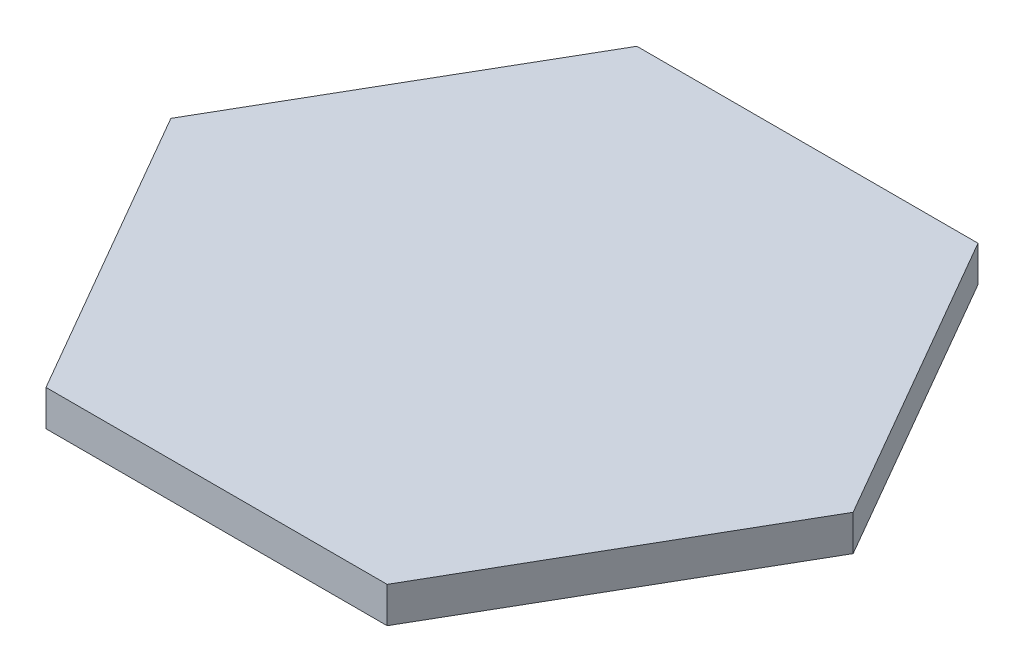
ISO-10303-21;
HEADER;
FILE_DESCRIPTION(('STEP AP214'),'2;1');
FILE_NAME('part.step','',(''),(''),'','','');
FILE_SCHEMA(('AUTOMOTIVE_DESIGN { 1 0 10303 214 1 1 1 1 }'));
ENDSEC;
DATA;
#1=APPLICATION_CONTEXT('core data for automotive mechanical design processes');
#2=APPLICATION_PROTOCOL_DEFINITION('international standard','automotive_design',2000,#1);
#3=PRODUCT_CONTEXT('',#1,'mechanical');
#4=PRODUCT('Part','Part','',(#3));
#5=PRODUCT_RELATED_PRODUCT_CATEGORY('part','',(#4));
#6=PRODUCT_DEFINITION_FORMATION('','',#4);
#7=PRODUCT_DEFINITION_CONTEXT('part definition',#1,'design');
#8=PRODUCT_DEFINITION('design','',#6,#7);
#9=PRODUCT_DEFINITION_SHAPE('','',#8);
#10=(LENGTH_UNIT() NAMED_UNIT(*) SI_UNIT(.MILLI.,.METRE.));
#11=(NAMED_UNIT(*) PLANE_ANGLE_UNIT() SI_UNIT($,.RADIAN.));
#12=(NAMED_UNIT(*) SI_UNIT($,.STERADIAN.) SOLID_ANGLE_UNIT());
#13=UNCERTAINTY_MEASURE_WITH_UNIT(LENGTH_MEASURE(1.E-05),#10,'distance_accuracy_value','');
#14=(GEOMETRIC_REPRESENTATION_CONTEXT(3) GLOBAL_UNCERTAINTY_ASSIGNED_CONTEXT((#13)) GLOBAL_UNIT_ASSIGNED_CONTEXT((#10,
#11,#12)) REPRESENTATION_CONTEXT('',''));
#15=CARTESIAN_POINT('',(0.,0.,0.));
#16=DIRECTION('',(0.,0.,1.));
#17=DIRECTION('',(1.,0.,0.));
#18=AXIS2_PLACEMENT_3D('',#15,#16,#17);
#19=CARTESIAN_POINT('',(35.7,7.5,61.8342138302089));
#20=DIRECTION('',(-0.866025403784439,0.,-0.5));
#21=DIRECTION('',(-0.5,0.,0.866025403784439));
#22=AXIS2_PLACEMENT_3D('',#19,#20,#21);
#23=PLANE('',#22);
#24=DIRECTION('',(0.5,0.,-0.866025403784439));
#25=VECTOR('',#24,1.);
#26=CARTESIAN_POINT('',(35.7,0.,61.8342138302089));
#27=LINE('',#26,#25);
#28=CARTESIAN_POINT('',(35.7,0.,61.8342138302089));
#29=VERTEX_POINT('',#28);
#30=CARTESIAN_POINT('',(71.4,0.,0.));
#31=VERTEX_POINT('',#30);
#32=EDGE_CURVE('E125',#29,#31,#27,.T.);
#33=ORIENTED_EDGE('',*,*,#32,.T.);
#34=DIRECTION('',(0.,-1.,0.));
#35=VECTOR('',#34,1.);
#36=CARTESIAN_POINT('',(71.4,7.5,0.));
#37=LINE('',#36,#35);
#38=CARTESIAN_POINT('',(71.4,7.5,0.));
#39=VERTEX_POINT('',#38);
#40=EDGE_CURVE('E11',#39,#31,#37,.T.);
#41=ORIENTED_EDGE('',*,*,#40,.F.);
#42=DIRECTION('',(0.5,0.,-0.866025403784439));
#43=VECTOR('',#42,1.);
#44=CARTESIAN_POINT('',(35.7,7.5,61.8342138302089));
#45=LINE('',#44,#43);
#46=CARTESIAN_POINT('',(35.7,7.5,61.8342138302089));
#47=VERTEX_POINT('',#46);
#48=EDGE_CURVE('E135',#47,#39,#45,.T.);
#49=ORIENTED_EDGE('',*,*,#48,.F.);
#50=DIRECTION('',(0.,-1.,0.));
#51=VECTOR('',#50,1.);
#52=CARTESIAN_POINT('',(35.7,7.5,61.8342138302089));
#53=LINE('',#52,#51);
#54=EDGE_CURVE('E121',#47,#29,#53,.T.);
#55=ORIENTED_EDGE('',*,*,#54,.T.);
#56=EDGE_LOOP('',(#33,#41,#49,#55));
#57=FACE_BOUND('',#56,.T.);
#58=ADVANCED_FACE('F41',(#57),#23,.F.);
#59=CARTESIAN_POINT('',(71.4,7.5,0.));
#60=DIRECTION('',(-0.866025403784439,0.,0.5));
#61=DIRECTION('',(0.5,0.,0.866025403784439));
#62=AXIS2_PLACEMENT_3D('',#59,#60,#61);
#63=PLANE('',#62);
#64=DIRECTION('',(-0.5,0.,-0.866025403784439));
#65=VECTOR('',#64,1.);
#66=CARTESIAN_POINT('',(71.4,0.,0.));
#67=LINE('',#66,#65);
#68=CARTESIAN_POINT('',(35.7,0.,-61.8342138302089));
#69=VERTEX_POINT('',#68);
#70=EDGE_CURVE('E128',#31,#69,#67,.T.);
#71=ORIENTED_EDGE('',*,*,#70,.T.);
#72=DIRECTION('',(0.,-1.,0.));
#73=VECTOR('',#72,1.);
#74=CARTESIAN_POINT('',(35.7,7.5,-61.8342138302089));
#75=LINE('',#74,#73);
#76=CARTESIAN_POINT('',(35.7,7.5,-61.8342138302089));
#77=VERTEX_POINT('',#76);
#78=EDGE_CURVE('E49',#77,#69,#75,.T.);
#79=ORIENTED_EDGE('',*,*,#78,.F.);
#80=DIRECTION('',(-0.5,0.,-0.866025403784439));
#81=VECTOR('',#80,1.);
#82=CARTESIAN_POINT('',(71.4,7.5,0.));
#83=LINE('',#82,#81);
#84=EDGE_CURVE('E94',#39,#77,#83,.T.);
#85=ORIENTED_EDGE('',*,*,#84,.F.);
#86=ORIENTED_EDGE('',*,*,#40,.T.);
#87=EDGE_LOOP('',(#71,#79,#85,#86));
#88=FACE_BOUND('',#87,.T.);
#89=ADVANCED_FACE('F159',(#88),#63,.F.);
#90=CARTESIAN_POINT('',(35.7,7.5,-61.8342138302089));
#91=DIRECTION('',(0.,0.,1.));
#92=DIRECTION('',(1.,0.,0.));
#93=AXIS2_PLACEMENT_3D('',#90,#91,#92);
#94=PLANE('',#93);
#95=DIRECTION('',(-1.,0.,0.));
#96=VECTOR('',#95,1.);
#97=CARTESIAN_POINT('',(35.7,0.,-61.8342138302089));
#98=LINE('',#97,#96);
#99=CARTESIAN_POINT('',(-35.7,0.,-61.8342138302089));
#100=VERTEX_POINT('',#99);
#101=EDGE_CURVE('E130',#69,#100,#98,.T.);
#102=ORIENTED_EDGE('',*,*,#101,.T.);
#103=DIRECTION('',(0.,-1.,0.));
#104=VECTOR('',#103,1.);
#105=CARTESIAN_POINT('',(-35.7,7.5,-61.8342138302089));
#106=LINE('',#105,#104);
#107=CARTESIAN_POINT('',(-35.7,7.5,-61.8342138302089));
#108=VERTEX_POINT('',#107);
#109=EDGE_CURVE('E116',#108,#100,#106,.T.);
#110=ORIENTED_EDGE('',*,*,#109,.F.);
#111=DIRECTION('',(-1.,0.,0.));
#112=VECTOR('',#111,1.);
#113=CARTESIAN_POINT('',(35.7,7.5,-61.8342138302089));
#114=LINE('',#113,#112);
#115=EDGE_CURVE('E107',#77,#108,#114,.T.);
#116=ORIENTED_EDGE('',*,*,#115,.F.);
#117=ORIENTED_EDGE('',*,*,#78,.T.);
#118=EDGE_LOOP('',(#102,#110,#116,#117));
#119=FACE_BOUND('',#118,.T.);
#120=ADVANCED_FACE('F141',(#119),#94,.F.);
#121=CARTESIAN_POINT('',(-35.7,7.5,-61.8342138302089));
#122=DIRECTION('',(0.866025403784439,0.,0.5));
#123=DIRECTION('',(0.5,0.,-0.866025403784439));
#124=AXIS2_PLACEMENT_3D('',#121,#122,#123);
#125=PLANE('',#124);
#126=DIRECTION('',(-0.5,0.,0.866025403784439));
#127=VECTOR('',#126,1.);
#128=CARTESIAN_POINT('',(-35.7,0.,-61.8342138302089));
#129=LINE('',#128,#127);
#130=CARTESIAN_POINT('',(-71.4,0.,0.));
#131=VERTEX_POINT('',#130);
#132=EDGE_CURVE('E115',#100,#131,#129,.T.);
#133=ORIENTED_EDGE('',*,*,#132,.T.);
#134=DIRECTION('',(0.,-1.,0.));
#135=VECTOR('',#134,1.);
#136=CARTESIAN_POINT('',(-71.4,7.5,0.));
#137=LINE('',#136,#135);
#138=CARTESIAN_POINT('',(-71.4,7.5,0.));
#139=VERTEX_POINT('',#138);
#140=EDGE_CURVE('E112',#139,#131,#137,.T.);
#141=ORIENTED_EDGE('',*,*,#140,.F.);
#142=DIRECTION('',(-0.5,0.,0.866025403784439));
#143=VECTOR('',#142,1.);
#144=CARTESIAN_POINT('',(-35.7,7.5,-61.8342138302089));
#145=LINE('',#144,#143);
#146=EDGE_CURVE('E101',#108,#139,#145,.T.);
#147=ORIENTED_EDGE('',*,*,#146,.F.);
#148=ORIENTED_EDGE('',*,*,#109,.T.);
#149=EDGE_LOOP('',(#133,#141,#147,#148));
#150=FACE_BOUND('',#149,.T.);
#151=ADVANCED_FACE('F113',(#150),#125,.F.);
#152=CARTESIAN_POINT('',(-71.4,7.5,0.));
#153=DIRECTION('',(0.866025403784439,0.,-0.5));
#154=DIRECTION('',(-0.5,0.,-0.866025403784439));
#155=AXIS2_PLACEMENT_3D('',#152,#153,#154);
#156=PLANE('',#155);
#157=DIRECTION('',(0.5,0.,0.866025403784439));
#158=VECTOR('',#157,1.);
#159=CARTESIAN_POINT('',(-71.4,0.,0.));
#160=LINE('',#159,#158);
#161=CARTESIAN_POINT('',(-35.7,0.,61.8342138302089));
#162=VERTEX_POINT('',#161);
#163=EDGE_CURVE('E80',#131,#162,#160,.T.);
#164=ORIENTED_EDGE('',*,*,#163,.T.);
#165=DIRECTION('',(0.,-1.,0.));
#166=VECTOR('',#165,1.);
#167=CARTESIAN_POINT('',(-35.7,7.5,61.8342138302089));
#168=LINE('',#167,#166);
#169=CARTESIAN_POINT('',(-35.7,7.5,61.8342138302089));
#170=VERTEX_POINT('',#169);
#171=EDGE_CURVE('E117',#170,#162,#168,.T.);
#172=ORIENTED_EDGE('',*,*,#171,.F.);
#173=DIRECTION('',(0.5,0.,0.866025403784439));
#174=VECTOR('',#173,1.);
#175=CARTESIAN_POINT('',(-71.4,7.5,0.));
#176=LINE('',#175,#174);
#177=EDGE_CURVE('E105',#139,#170,#176,.T.);
#178=ORIENTED_EDGE('',*,*,#177,.F.);
#179=ORIENTED_EDGE('',*,*,#140,.T.);
#180=EDGE_LOOP('',(#164,#172,#178,#179));
#181=FACE_BOUND('',#180,.T.);
#182=ADVANCED_FACE('F119',(#181),#156,.F.);
#183=CARTESIAN_POINT('',(-35.7,7.5,61.8342138302089));
#184=DIRECTION('',(0.,0.,-1.));
#185=DIRECTION('',(-1.,0.,0.));
#186=AXIS2_PLACEMENT_3D('',#183,#184,#185);
#187=PLANE('',#186);
#188=DIRECTION('',(1.,0.,0.));
#189=VECTOR('',#188,1.);
#190=CARTESIAN_POINT('',(-35.7,0.,61.8342138302089));
#191=LINE('',#190,#189);
#192=EDGE_CURVE('E86',#162,#29,#191,.T.);
#193=ORIENTED_EDGE('',*,*,#192,.T.);
#194=ORIENTED_EDGE('',*,*,#54,.F.);
#195=DIRECTION('',(1.,0.,0.));
#196=VECTOR('',#195,1.);
#197=CARTESIAN_POINT('',(-35.7,7.5,61.8342138302089));
#198=LINE('',#197,#196);
#199=EDGE_CURVE('E57',#170,#47,#198,.T.);
#200=ORIENTED_EDGE('',*,*,#199,.F.);
#201=ORIENTED_EDGE('',*,*,#171,.T.);
#202=EDGE_LOOP('',(#193,#194,#200,#201));
#203=FACE_BOUND('',#202,.T.);
#204=ADVANCED_FACE('F148',(#203),#187,.F.);
#205=CARTESIAN_POINT('',(0.,7.5,0.));
#206=DIRECTION('',(0.,1.,0.));
#207=DIRECTION('',(0.,0.,1.));
#208=AXIS2_PLACEMENT_3D('',#205,#206,#207);
#209=PLANE('',#208);
#210=ORIENTED_EDGE('',*,*,#48,.T.);
#211=ORIENTED_EDGE('',*,*,#84,.T.);
#212=ORIENTED_EDGE('',*,*,#115,.T.);
#213=ORIENTED_EDGE('',*,*,#146,.T.);
#214=ORIENTED_EDGE('',*,*,#177,.T.);
#215=ORIENTED_EDGE('',*,*,#199,.T.);
#216=EDGE_LOOP('',(#210,#211,#212,#213,#214,#215));
#217=FACE_BOUND('',#216,.T.);
#218=ADVANCED_FACE('F103',(#217),#209,.T.);
#219=CARTESIAN_POINT('',(0.,0.,0.));
#220=DIRECTION('',(0.,1.,0.));
#221=DIRECTION('',(0.,0.,1.));
#222=AXIS2_PLACEMENT_3D('',#219,#220,#221);
#223=PLANE('',#222);
#224=ORIENTED_EDGE('',*,*,#32,.F.);
#225=ORIENTED_EDGE('',*,*,#192,.F.);
#226=ORIENTED_EDGE('',*,*,#163,.F.);
#227=ORIENTED_EDGE('',*,*,#132,.F.);
#228=ORIENTED_EDGE('',*,*,#101,.F.);
#229=ORIENTED_EDGE('',*,*,#70,.F.);
#230=EDGE_LOOP('',(#224,#225,#226,#227,#228,#229));
#231=FACE_BOUND('',#230,.T.);
#232=ADVANCED_FACE('F144',(#231),#223,.F.);
#233=CLOSED_SHELL('',(#58,#89,#120,#151,#182,#204,#218,#232));
#234=MANIFOLD_SOLID_BREP('B2',#233);
#235=ADVANCED_BREP_SHAPE_REPRESENTATION('',(#18,#234),#14);
#236=SHAPE_DEFINITION_REPRESENTATION(#9,#235);
ENDSEC;
END-ISO-10303-21;
